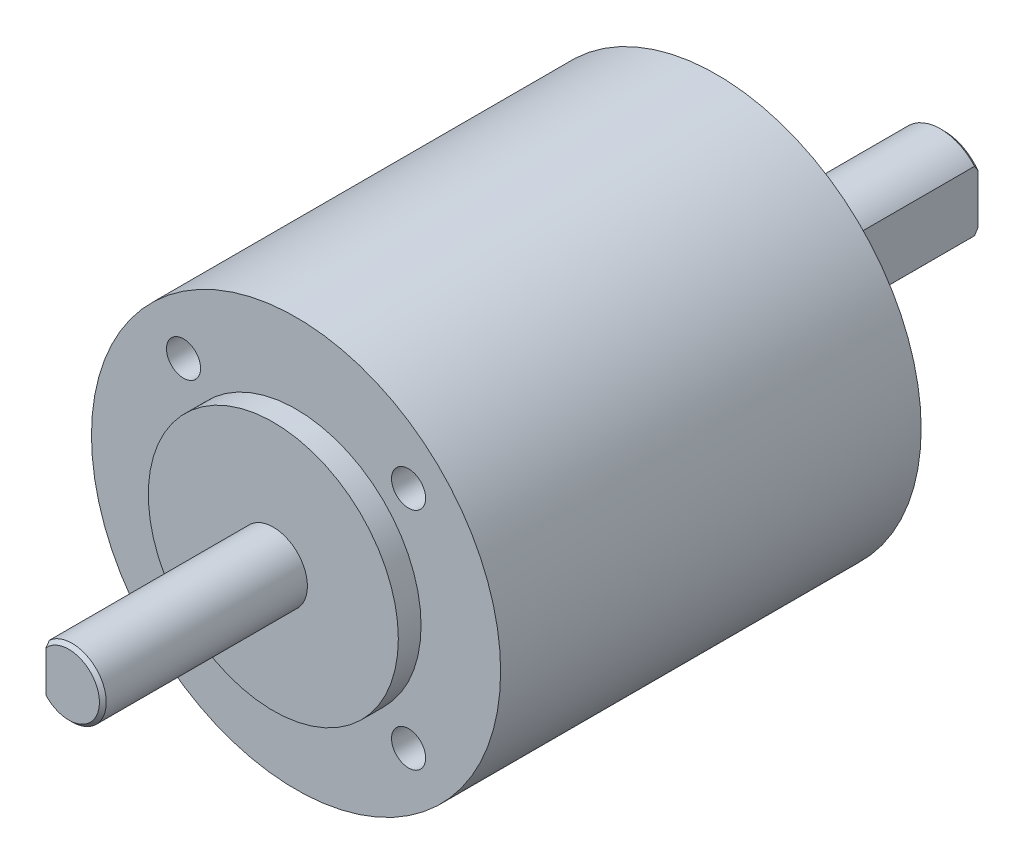
ISO-10303-21;
HEADER;
FILE_DESCRIPTION(('STEP AP214'),'2;1');
FILE_NAME('part.step','',(''),(''),'','','');
FILE_SCHEMA(('AUTOMOTIVE_DESIGN { 1 0 10303 214 1 1 1 1 }'));
ENDSEC;
DATA;
#1=APPLICATION_CONTEXT('core data for automotive mechanical design processes');
#2=APPLICATION_PROTOCOL_DEFINITION('international standard','automotive_design',2000,#1);
#3=PRODUCT_CONTEXT('',#1,'mechanical');
#4=PRODUCT('Part','Part','',(#3));
#5=PRODUCT_RELATED_PRODUCT_CATEGORY('part','',(#4));
#6=PRODUCT_DEFINITION_FORMATION('','',#4);
#7=PRODUCT_DEFINITION_CONTEXT('part definition',#1,'design');
#8=PRODUCT_DEFINITION('design','',#6,#7);
#9=PRODUCT_DEFINITION_SHAPE('','',#8);
#10=(LENGTH_UNIT() NAMED_UNIT(*) SI_UNIT(.MILLI.,.METRE.));
#11=(NAMED_UNIT(*) PLANE_ANGLE_UNIT() SI_UNIT($,.RADIAN.));
#12=(NAMED_UNIT(*) SI_UNIT($,.STERADIAN.) SOLID_ANGLE_UNIT());
#13=UNCERTAINTY_MEASURE_WITH_UNIT(LENGTH_MEASURE(1.E-05),#10,'distance_accuracy_value','');
#14=(GEOMETRIC_REPRESENTATION_CONTEXT(3) GLOBAL_UNCERTAINTY_ASSIGNED_CONTEXT((#13)) GLOBAL_UNIT_ASSIGNED_CONTEXT((#10,
#11,#12)) REPRESENTATION_CONTEXT('',''));
#15=CARTESIAN_POINT('',(0.,0.,0.));
#16=DIRECTION('',(0.,0.,1.));
#17=DIRECTION('',(1.,0.,0.));
#18=AXIS2_PLACEMENT_3D('',#15,#16,#17);
#19=CARTESIAN_POINT('',(0.,0.,-18.5));
#20=DIRECTION('',(0.,0.,1.));
#21=DIRECTION('',(1.,0.,0.));
#22=AXIS2_PLACEMENT_3D('',#19,#20,#21);
#23=CYLINDRICAL_SURFACE('',#22,18.);
#24=CARTESIAN_POINT('',(0.,0.,-18.5));
#25=DIRECTION('',(0.,0.,1.));
#26=DIRECTION('',(1.,0.,0.));
#27=AXIS2_PLACEMENT_3D('',#24,#25,#26);
#28=CIRCLE('',#27,18.);
#29=CARTESIAN_POINT('',(18.,0.,-18.5));
#30=VERTEX_POINT('',#29);
#31=EDGE_CURVE('E186',#30,#30,#28,.T.);
#32=ORIENTED_EDGE('',*,*,#31,.T.);
#33=EDGE_LOOP('',(#32));
#34=FACE_BOUND('',#33,.T.);
#35=CARTESIAN_POINT('',(0.,0.,18.5));
#36=DIRECTION('',(0.,0.,1.));
#37=DIRECTION('',(1.,0.,0.));
#38=AXIS2_PLACEMENT_3D('',#35,#36,#37);
#39=CIRCLE('',#38,18.);
#40=CARTESIAN_POINT('',(18.,0.,18.5));
#41=VERTEX_POINT('',#40);
#42=EDGE_CURVE('E190',#41,#41,#39,.T.);
#43=ORIENTED_EDGE('',*,*,#42,.F.);
#44=EDGE_LOOP('',(#43));
#45=FACE_BOUND('',#44,.T.);
#46=ADVANCED_FACE('F38',(#34,#45),#23,.T.);
#47=CARTESIAN_POINT('',(0.,0.,-18.5));
#48=DIRECTION('',(0.,0.,1.));
#49=DIRECTION('',(1.,0.,0.));
#50=AXIS2_PLACEMENT_3D('',#47,#48,#49);
#51=PLANE('',#50);
#52=CARTESIAN_POINT('',(9.89949493661111,-9.89949493661167,-18.5));
#53=DIRECTION('',(0.,0.,-1.));
#54=DIRECTION('',(-1.,0.,0.));
#55=AXIS2_PLACEMENT_3D('',#52,#53,#54);
#56=CIRCLE('',#55,1.50000000000023);
#57=CARTESIAN_POINT('',(8.39949493661089,-9.89949493661167,-18.5));
#58=VERTEX_POINT('',#57);
#59=EDGE_CURVE('E126',#58,#58,#56,.T.);
#60=ORIENTED_EDGE('',*,*,#59,.F.);
#61=EDGE_LOOP('',(#60));
#62=FACE_BOUND('',#61,.T.);
#63=CARTESIAN_POINT('',(-9.89949493661222,-9.89949493661111,-18.5));
#64=DIRECTION('',(0.,0.,-1.));
#65=DIRECTION('',(-1.,0.,0.));
#66=AXIS2_PLACEMENT_3D('',#63,#64,#65);
#67=CIRCLE('',#66,1.50000000000071);
#68=CARTESIAN_POINT('',(-11.3994949366129,-9.89949493661111,-18.5));
#69=VERTEX_POINT('',#68);
#70=EDGE_CURVE('E138',#69,#69,#67,.T.);
#71=ORIENTED_EDGE('',*,*,#70,.F.);
#72=EDGE_LOOP('',(#71));
#73=FACE_BOUND('',#72,.T.);
#74=CARTESIAN_POINT('',(-9.89949493661167,9.89949493661222,-18.5));
#75=DIRECTION('',(0.,0.,-1.));
#76=DIRECTION('',(-1.,0.,0.));
#77=AXIS2_PLACEMENT_3D('',#74,#75,#76);
#78=CIRCLE('',#77,1.5000000000005);
#79=CARTESIAN_POINT('',(-11.3994949366122,9.89949493661222,-18.5));
#80=VERTEX_POINT('',#79);
#81=EDGE_CURVE('E132',#80,#80,#78,.T.);
#82=ORIENTED_EDGE('',*,*,#81,.F.);
#83=EDGE_LOOP('',(#82));
#84=FACE_BOUND('',#83,.T.);
#85=CARTESIAN_POINT('',(9.89949493661172,9.89949493661161,-18.5));
#86=DIRECTION('',(0.,0.,-1.));
#87=DIRECTION('',(-1.,0.,0.));
#88=AXIS2_PLACEMENT_3D('',#85,#86,#87);
#89=CIRCLE('',#88,1.5);
#90=CARTESIAN_POINT('',(8.39949493661172,9.89949493661161,-18.5));
#91=VERTEX_POINT('',#90);
#92=EDGE_CURVE('E131',#91,#91,#89,.T.);
#93=ORIENTED_EDGE('',*,*,#92,.F.);
#94=EDGE_LOOP('',(#93));
#95=FACE_BOUND('',#94,.T.);
#96=CARTESIAN_POINT('',(0.,0.,-18.5));
#97=DIRECTION('',(0.,0.,1.));
#98=DIRECTION('',(1.,0.,0.));
#99=AXIS2_PLACEMENT_3D('',#96,#97,#98);
#100=CIRCLE('',#99,11.);
#101=CARTESIAN_POINT('',(11.,0.,-18.5));
#102=VERTEX_POINT('',#101);
#103=EDGE_CURVE('E189',#102,#102,#100,.F.);
#104=ORIENTED_EDGE('',*,*,#103,.F.);
#105=EDGE_LOOP('',(#104));
#106=FACE_BOUND('',#105,.T.);
#107=ORIENTED_EDGE('',*,*,#31,.F.);
#108=EDGE_LOOP('',(#107));
#109=FACE_BOUND('',#108,.T.);
#110=ADVANCED_FACE('F272',(#62,#73,#84,#95,#106,#109),#51,.F.);
#111=CARTESIAN_POINT('',(0.,0.,18.5));
#112=DIRECTION('',(0.,0.,1.));
#113=DIRECTION('',(1.,0.,0.));
#114=AXIS2_PLACEMENT_3D('',#111,#112,#113);
#115=PLANE('',#114);
#116=CARTESIAN_POINT('',(-9.8994949366111,-9.89949493661167,18.5));
#117=DIRECTION('',(0.,0.,1.));
#118=DIRECTION('',(1.,0.,0.));
#119=AXIS2_PLACEMENT_3D('',#116,#117,#118);
#120=CIRCLE('',#119,1.50000000000023);
#121=CARTESIAN_POINT('',(-8.39949493661087,-9.89949493661167,18.5));
#122=VERTEX_POINT('',#121);
#123=EDGE_CURVE('E171',#122,#122,#120,.T.);
#124=ORIENTED_EDGE('',*,*,#123,.F.);
#125=EDGE_LOOP('',(#124));
#126=FACE_BOUND('',#125,.T.);
#127=CARTESIAN_POINT('',(9.89949493661223,-9.8994949366111,18.5));
#128=DIRECTION('',(0.,0.,1.));
#129=DIRECTION('',(1.,0.,0.));
#130=AXIS2_PLACEMENT_3D('',#127,#128,#129);
#131=CIRCLE('',#130,1.50000000000073);
#132=CARTESIAN_POINT('',(11.399494936613,-9.8994949366111,18.5));
#133=VERTEX_POINT('',#132);
#134=EDGE_CURVE('E165',#133,#133,#131,.T.);
#135=ORIENTED_EDGE('',*,*,#134,.F.);
#136=EDGE_LOOP('',(#135));
#137=FACE_BOUND('',#136,.T.);
#138=CARTESIAN_POINT('',(9.89949493661167,9.89949493661222,18.5));
#139=DIRECTION('',(0.,0.,1.));
#140=DIRECTION('',(1.,0.,0.));
#141=AXIS2_PLACEMENT_3D('',#138,#139,#140);
#142=CIRCLE('',#141,1.50000000000051);
#143=CARTESIAN_POINT('',(11.3994949366122,9.89949493661222,18.5));
#144=VERTEX_POINT('',#143);
#145=EDGE_CURVE('E159',#144,#144,#142,.T.);
#146=ORIENTED_EDGE('',*,*,#145,.F.);
#147=EDGE_LOOP('',(#146));
#148=FACE_BOUND('',#147,.T.);
#149=CARTESIAN_POINT('',(-9.89949493661172,9.89949493661161,18.5));
#150=DIRECTION('',(0.,0.,1.));
#151=DIRECTION('',(1.,0.,0.));
#152=AXIS2_PLACEMENT_3D('',#149,#150,#151);
#153=CIRCLE('',#152,1.5);
#154=CARTESIAN_POINT('',(-8.39949493661172,9.89949493661161,18.5));
#155=VERTEX_POINT('',#154);
#156=EDGE_CURVE('E158',#155,#155,#153,.T.);
#157=ORIENTED_EDGE('',*,*,#156,.F.);
#158=EDGE_LOOP('',(#157));
#159=FACE_BOUND('',#158,.T.);
#160=CARTESIAN_POINT('',(0.,0.,18.5));
#161=DIRECTION('',(0.,0.,1.));
#162=DIRECTION('',(1.,0.,0.));
#163=AXIS2_PLACEMENT_3D('',#160,#161,#162);
#164=CIRCLE('',#163,11.);
#165=CARTESIAN_POINT('',(11.,0.,18.5));
#166=VERTEX_POINT('',#165);
#167=EDGE_CURVE('E177',#166,#166,#164,.T.);
#168=ORIENTED_EDGE('',*,*,#167,.F.);
#169=EDGE_LOOP('',(#168));
#170=FACE_BOUND('',#169,.T.);
#171=ORIENTED_EDGE('',*,*,#42,.T.);
#172=EDGE_LOOP('',(#171));
#173=FACE_BOUND('',#172,.T.);
#174=ADVANCED_FACE('F277',(#126,#137,#148,#159,#170,#173),#115,.T.);
#175=CARTESIAN_POINT('',(0.,0.,20.5));
#176=DIRECTION('',(0.,0.,-1.));
#177=DIRECTION('',(-1.,0.,0.));
#178=AXIS2_PLACEMENT_3D('',#175,#176,#177);
#179=CYLINDRICAL_SURFACE('',#178,11.);
#180=CARTESIAN_POINT('',(0.,0.,20.5));
#181=DIRECTION('',(0.,0.,1.));
#182=DIRECTION('',(1.,0.,0.));
#183=AXIS2_PLACEMENT_3D('',#180,#181,#182);
#184=CIRCLE('',#183,11.);
#185=CARTESIAN_POINT('',(11.,0.,20.5));
#186=VERTEX_POINT('',#185);
#187=EDGE_CURVE('E180',#186,#186,#184,.T.);
#188=ORIENTED_EDGE('',*,*,#187,.F.);
#189=EDGE_LOOP('',(#188));
#190=FACE_BOUND('',#189,.T.);
#191=ORIENTED_EDGE('',*,*,#167,.T.);
#192=EDGE_LOOP('',(#191));
#193=FACE_BOUND('',#192,.T.);
#194=ADVANCED_FACE('F283',(#190,#193),#179,.T.);
#195=CARTESIAN_POINT('',(0.,0.,20.5));
#196=DIRECTION('',(0.,0.,1.));
#197=DIRECTION('',(1.,0.,0.));
#198=AXIS2_PLACEMENT_3D('',#195,#196,#197);
#199=PLANE('',#198);
#200=CARTESIAN_POINT('',(0.,0.,20.5));
#201=DIRECTION('',(0.,0.,1.));
#202=DIRECTION('',(1.,0.,0.));
#203=AXIS2_PLACEMENT_3D('',#200,#201,#202);
#204=CIRCLE('',#203,3.);
#205=CARTESIAN_POINT('',(3.,0.,20.5));
#206=VERTEX_POINT('',#205);
#207=EDGE_CURVE('E183',#206,#206,#204,.T.);
#208=ORIENTED_EDGE('',*,*,#207,.F.);
#209=EDGE_LOOP('',(#208));
#210=FACE_BOUND('',#209,.T.);
#211=ORIENTED_EDGE('',*,*,#187,.T.);
#212=EDGE_LOOP('',(#211));
#213=FACE_BOUND('',#212,.T.);
#214=ADVANCED_FACE('F293',(#210,#213),#199,.T.);
#215=CARTESIAN_POINT('',(0.,0.,38.5));
#216=DIRECTION('',(0.,0.,1.));
#217=DIRECTION('',(1.,0.,0.));
#218=AXIS2_PLACEMENT_3D('',#215,#216,#217);
#219=PLANE('',#218);
#220=DIRECTION('',(0.,1.,0.));
#221=VECTOR('',#220,1.);
#222=CARTESIAN_POINT('',(-2.,2.23606797749979,38.5));
#223=LINE('',#222,#221);
#224=CARTESIAN_POINT('',(-2.,-1.81383571472174,38.5));
#225=VERTEX_POINT('',#224);
#226=CARTESIAN_POINT('',(-2.,1.81383571472174,38.5));
#227=VERTEX_POINT('',#226);
#228=EDGE_CURVE('E114',#225,#227,#223,.T.);
#229=ORIENTED_EDGE('',*,*,#228,.F.);
#230=CARTESIAN_POINT('',(0.,0.,38.5));
#231=DIRECTION('',(0.,0.,1.));
#232=DIRECTION('',(1.,0.,0.));
#233=AXIS2_PLACEMENT_3D('',#230,#231,#232);
#234=CIRCLE('',#233,2.70000000000002);
#235=EDGE_CURVE('E247',#225,#227,#234,.T.);
#236=ORIENTED_EDGE('',*,*,#235,.T.);
#237=EDGE_LOOP('',(#229,#236));
#238=FACE_BOUND('',#237,.T.);
#239=ADVANCED_FACE('F290',(#238),#219,.T.);
#240=CARTESIAN_POINT('',(0.,0.,38.5));
#241=DIRECTION('',(0.,0.,-1.));
#242=DIRECTION('',(-1.,0.,0.));
#243=AXIS2_PLACEMENT_3D('',#240,#241,#242);
#244=CYLINDRICAL_SURFACE('',#243,3.);
#245=DIRECTION('',(0.,0.,1.));
#246=VECTOR('',#245,1.);
#247=CARTESIAN_POINT('',(-2.,2.23606797749979,23.5));
#248=LINE('',#247,#246);
#249=CARTESIAN_POINT('',(-2.,2.23606797749979,23.5));
#250=VERTEX_POINT('',#249);
#251=CARTESIAN_POINT('',(-2.,2.23606797749979,38.2));
#252=VERTEX_POINT('',#251);
#253=EDGE_CURVE('E124',#250,#252,#248,.T.);
#254=ORIENTED_EDGE('',*,*,#253,.T.);
#255=CARTESIAN_POINT('',(0.,0.,38.2));
#256=DIRECTION('',(0.,0.,1.));
#257=DIRECTION('',(1.,0.,0.));
#258=AXIS2_PLACEMENT_3D('',#255,#256,#257);
#259=CIRCLE('',#258,3.);
#260=CARTESIAN_POINT('',(-2.,-2.23606797749979,38.2));
#261=VERTEX_POINT('',#260);
#262=EDGE_CURVE('E11',#252,#261,#259,.F.);
#263=ORIENTED_EDGE('',*,*,#262,.T.);
#264=DIRECTION('',(0.,0.,1.));
#265=VECTOR('',#264,1.);
#266=CARTESIAN_POINT('',(-2.,-2.23606797749979,23.5));
#267=LINE('',#266,#265);
#268=CARTESIAN_POINT('',(-2.,-2.23606797749979,23.5));
#269=VERTEX_POINT('',#268);
#270=EDGE_CURVE('E122',#269,#261,#267,.T.);
#271=ORIENTED_EDGE('',*,*,#270,.F.);
#272=CARTESIAN_POINT('',(0.,0.,23.5));
#273=DIRECTION('',(0.,0.,1.));
#274=DIRECTION('',(1.,0.,0.));
#275=AXIS2_PLACEMENT_3D('',#272,#273,#274);
#276=CIRCLE('',#275,3.);
#277=EDGE_CURVE('E118',#250,#269,#276,.T.);
#278=ORIENTED_EDGE('',*,*,#277,.F.);
#279=EDGE_LOOP('',(#254,#263,#271,#278));
#280=FACE_BOUND('',#279,.T.);
#281=ORIENTED_EDGE('',*,*,#207,.T.);
#282=EDGE_LOOP('',(#281));
#283=FACE_BOUND('',#282,.T.);
#284=ADVANCED_FACE('F286',(#280,#283),#244,.T.);
#285=CARTESIAN_POINT('',(-9.89949493661172,9.89949493661161,10.5));
#286=DIRECTION('',(0.,0.,1.));
#287=DIRECTION('',(1.,0.,0.));
#288=AXIS2_PLACEMENT_3D('',#285,#286,#287);
#289=CYLINDRICAL_SURFACE('',#288,1.5);
#290=CARTESIAN_POINT('',(-9.89949493661172,9.89949493661161,10.5));
#291=DIRECTION('',(0.,0.,1.));
#292=DIRECTION('',(1.,0.,0.));
#293=AXIS2_PLACEMENT_3D('',#290,#291,#292);
#294=CIRCLE('',#293,1.5);
#295=CARTESIAN_POINT('',(-8.39949493661172,9.89949493661161,10.5));
#296=VERTEX_POINT('',#295);
#297=EDGE_CURVE('E174',#296,#296,#294,.T.);
#298=ORIENTED_EDGE('',*,*,#297,.F.);
#299=EDGE_LOOP('',(#298));
#300=FACE_BOUND('',#299,.T.);
#301=ORIENTED_EDGE('',*,*,#156,.T.);
#302=EDGE_LOOP('',(#301));
#303=FACE_BOUND('',#302,.T.);
#304=ADVANCED_FACE('F289',(#300,#303),#289,.F.);
#305=CARTESIAN_POINT('',(-9.89949493661172,9.89949493661161,10.5));
#306=DIRECTION('',(0.,0.,1.));
#307=DIRECTION('',(1.,0.,0.));
#308=AXIS2_PLACEMENT_3D('',#305,#306,#307);
#309=PLANE('',#308);
#310=ORIENTED_EDGE('',*,*,#297,.T.);
#311=EDGE_LOOP('',(#310));
#312=FACE_BOUND('',#311,.T.);
#313=ADVANCED_FACE('F302',(#312),#309,.T.);
#314=CARTESIAN_POINT('',(9.89949493661167,9.89949493661222,10.5));
#315=DIRECTION('',(0.,0.,1.));
#316=DIRECTION('',(1.,0.,0.));
#317=AXIS2_PLACEMENT_3D('',#314,#315,#316);
#318=CYLINDRICAL_SURFACE('',#317,1.50000000000051);
#319=CARTESIAN_POINT('',(9.89949493661167,9.89949493661222,10.5));
#320=DIRECTION('',(0.,0.,1.));
#321=DIRECTION('',(1.,0.,0.));
#322=AXIS2_PLACEMENT_3D('',#319,#320,#321);
#323=CIRCLE('',#322,1.50000000000051);
#324=CARTESIAN_POINT('',(11.3994949366122,9.89949493661222,10.5));
#325=VERTEX_POINT('',#324);
#326=EDGE_CURVE('E155',#325,#325,#323,.T.);
#327=ORIENTED_EDGE('',*,*,#326,.F.);
#328=EDGE_LOOP('',(#327));
#329=FACE_BOUND('',#328,.T.);
#330=ORIENTED_EDGE('',*,*,#145,.T.);
#331=EDGE_LOOP('',(#330));
#332=FACE_BOUND('',#331,.T.);
#333=ADVANCED_FACE('F306',(#329,#332),#318,.F.);
#334=CARTESIAN_POINT('',(9.89949493661167,9.89949493661222,10.5));
#335=DIRECTION('',(0.,0.,1.));
#336=DIRECTION('',(1.,0.,0.));
#337=AXIS2_PLACEMENT_3D('',#334,#335,#336);
#338=PLANE('',#337);
#339=ORIENTED_EDGE('',*,*,#326,.T.);
#340=EDGE_LOOP('',(#339));
#341=FACE_BOUND('',#340,.T.);
#342=ADVANCED_FACE('F320',(#341),#338,.T.);
#343=CARTESIAN_POINT('',(9.89949493661223,-9.8994949366111,10.5));
#344=DIRECTION('',(0.,0.,1.));
#345=DIRECTION('',(1.,0.,0.));
#346=AXIS2_PLACEMENT_3D('',#343,#344,#345);
#347=CYLINDRICAL_SURFACE('',#346,1.50000000000073);
#348=CARTESIAN_POINT('',(9.89949493661223,-9.8994949366111,10.5));
#349=DIRECTION('',(0.,0.,1.));
#350=DIRECTION('',(1.,0.,0.));
#351=AXIS2_PLACEMENT_3D('',#348,#349,#350);
#352=CIRCLE('',#351,1.50000000000073);
#353=CARTESIAN_POINT('',(11.399494936613,-9.8994949366111,10.5));
#354=VERTEX_POINT('',#353);
#355=EDGE_CURVE('E162',#354,#354,#352,.T.);
#356=ORIENTED_EDGE('',*,*,#355,.F.);
#357=EDGE_LOOP('',(#356));
#358=FACE_BOUND('',#357,.T.);
#359=ORIENTED_EDGE('',*,*,#134,.T.);
#360=EDGE_LOOP('',(#359));
#361=FACE_BOUND('',#360,.T.);
#362=ADVANCED_FACE('F317',(#358,#361),#347,.F.);
#363=CARTESIAN_POINT('',(9.89949493661223,-9.8994949366111,10.5));
#364=DIRECTION('',(0.,0.,1.));
#365=DIRECTION('',(1.,0.,0.));
#366=AXIS2_PLACEMENT_3D('',#363,#364,#365);
#367=PLANE('',#366);
#368=ORIENTED_EDGE('',*,*,#355,.T.);
#369=EDGE_LOOP('',(#368));
#370=FACE_BOUND('',#369,.T.);
#371=ADVANCED_FACE('F312',(#370),#367,.T.);
#372=CARTESIAN_POINT('',(-9.8994949366111,-9.89949493661167,10.5));
#373=DIRECTION('',(0.,0.,1.));
#374=DIRECTION('',(1.,0.,0.));
#375=AXIS2_PLACEMENT_3D('',#372,#373,#374);
#376=CYLINDRICAL_SURFACE('',#375,1.50000000000023);
#377=CARTESIAN_POINT('',(-9.8994949366111,-9.89949493661167,10.5));
#378=DIRECTION('',(0.,0.,1.));
#379=DIRECTION('',(1.,0.,0.));
#380=AXIS2_PLACEMENT_3D('',#377,#378,#379);
#381=CIRCLE('',#380,1.50000000000023);
#382=CARTESIAN_POINT('',(-8.39949493661087,-9.89949493661167,10.5));
#383=VERTEX_POINT('',#382);
#384=EDGE_CURVE('E168',#383,#383,#381,.T.);
#385=ORIENTED_EDGE('',*,*,#384,.F.);
#386=EDGE_LOOP('',(#385));
#387=FACE_BOUND('',#386,.T.);
#388=ORIENTED_EDGE('',*,*,#123,.T.);
#389=EDGE_LOOP('',(#388));
#390=FACE_BOUND('',#389,.T.);
#391=ADVANCED_FACE('F308',(#387,#390),#376,.F.);
#392=CARTESIAN_POINT('',(-9.8994949366111,-9.89949493661167,10.5));
#393=DIRECTION('',(0.,0.,1.));
#394=DIRECTION('',(1.,0.,0.));
#395=AXIS2_PLACEMENT_3D('',#392,#393,#394);
#396=PLANE('',#395);
#397=ORIENTED_EDGE('',*,*,#384,.T.);
#398=EDGE_LOOP('',(#397));
#399=FACE_BOUND('',#398,.T.);
#400=ADVANCED_FACE('F311',(#399),#396,.T.);
#401=CARTESIAN_POINT('',(0.,0.,-20.5));
#402=DIRECTION('',(0.,0.,1.));
#403=DIRECTION('',(1.,0.,0.));
#404=AXIS2_PLACEMENT_3D('',#401,#402,#403);
#405=CYLINDRICAL_SURFACE('',#404,11.);
#406=CARTESIAN_POINT('',(0.,0.,-20.5));
#407=DIRECTION('',(0.,0.,-1.));
#408=DIRECTION('',(-1.,0.,0.));
#409=AXIS2_PLACEMENT_3D('',#406,#407,#408);
#410=CIRCLE('',#409,11.);
#411=CARTESIAN_POINT('',(-11.,0.,-20.5));
#412=VERTEX_POINT('',#411);
#413=EDGE_CURVE('E149',#412,#412,#410,.T.);
#414=ORIENTED_EDGE('',*,*,#413,.F.);
#415=EDGE_LOOP('',(#414));
#416=FACE_BOUND('',#415,.T.);
#417=ORIENTED_EDGE('',*,*,#103,.T.);
#418=EDGE_LOOP('',(#417));
#419=FACE_BOUND('',#418,.T.);
#420=ADVANCED_FACE('F267',(#416,#419),#405,.T.);
#421=CARTESIAN_POINT('',(0.,0.,-20.5));
#422=DIRECTION('',(0.,0.,-1.));
#423=DIRECTION('',(-1.,0.,0.));
#424=AXIS2_PLACEMENT_3D('',#421,#422,#423);
#425=PLANE('',#424);
#426=CARTESIAN_POINT('',(0.,0.,-20.5));
#427=DIRECTION('',(0.,0.,-1.));
#428=DIRECTION('',(-1.,0.,0.));
#429=AXIS2_PLACEMENT_3D('',#426,#427,#428);
#430=CIRCLE('',#429,4.);
#431=CARTESIAN_POINT('',(-4.,0.,-20.5));
#432=VERTEX_POINT('',#431);
#433=EDGE_CURVE('E154',#432,#432,#430,.T.);
#434=ORIENTED_EDGE('',*,*,#433,.F.);
#435=EDGE_LOOP('',(#434));
#436=FACE_BOUND('',#435,.T.);
#437=ORIENTED_EDGE('',*,*,#413,.T.);
#438=EDGE_LOOP('',(#437));
#439=FACE_BOUND('',#438,.T.);
#440=ADVANCED_FACE('F259',(#436,#439),#425,.T.);
#441=CARTESIAN_POINT('',(0.,0.,-38.5));
#442=DIRECTION('',(0.,0.,-1.));
#443=DIRECTION('',(-1.,0.,0.));
#444=AXIS2_PLACEMENT_3D('',#441,#442,#443);
#445=PLANE('',#444);
#446=DIRECTION('',(0.,1.,0.));
#447=VECTOR('',#446,1.);
#448=CARTESIAN_POINT('',(3.,2.64575131106459,-38.5));
#449=LINE('',#448,#447);
#450=CARTESIAN_POINT('',(3.,-2.16564078277081,-38.5));
#451=VERTEX_POINT('',#450);
#452=CARTESIAN_POINT('',(3.,2.16564078277081,-38.5));
#453=VERTEX_POINT('',#452);
#454=EDGE_CURVE('E99',#451,#453,#449,.T.);
#455=ORIENTED_EDGE('',*,*,#454,.F.);
#456=CARTESIAN_POINT('',(0.,0.,-38.5));
#457=DIRECTION('',(0.,0.,-1.));
#458=DIRECTION('',(-1.,0.,0.));
#459=AXIS2_PLACEMENT_3D('',#456,#457,#458);
#460=CIRCLE('',#459,3.70000000000002);
#461=EDGE_CURVE('E199',#451,#453,#460,.T.);
#462=ORIENTED_EDGE('',*,*,#461,.T.);
#463=EDGE_LOOP('',(#455,#462));
#464=FACE_BOUND('',#463,.T.);
#465=ADVANCED_FACE('F257',(#464),#445,.T.);
#466=CARTESIAN_POINT('',(0.,0.,-38.5));
#467=DIRECTION('',(0.,0.,1.));
#468=DIRECTION('',(1.,0.,0.));
#469=AXIS2_PLACEMENT_3D('',#466,#467,#468);
#470=CYLINDRICAL_SURFACE('',#469,4.);
#471=DIRECTION('',(0.,0.,-1.));
#472=VECTOR('',#471,1.);
#473=CARTESIAN_POINT('',(3.,2.64575131106459,-23.5));
#474=LINE('',#473,#472);
#475=CARTESIAN_POINT('',(3.,2.64575131106459,-23.5));
#476=VERTEX_POINT('',#475);
#477=CARTESIAN_POINT('',(3.,2.64575131106459,-38.2));
#478=VERTEX_POINT('',#477);
#479=EDGE_CURVE('E107',#476,#478,#474,.T.);
#480=ORIENTED_EDGE('',*,*,#479,.T.);
#481=CARTESIAN_POINT('',(0.,0.,-38.2));
#482=DIRECTION('',(0.,0.,-1.));
#483=DIRECTION('',(-1.,0.,0.));
#484=AXIS2_PLACEMENT_3D('',#481,#482,#483);
#485=CIRCLE('',#484,4.);
#486=CARTESIAN_POINT('',(3.,-2.64575131106459,-38.2));
#487=VERTEX_POINT('',#486);
#488=EDGE_CURVE('E112',#478,#487,#485,.F.);
#489=ORIENTED_EDGE('',*,*,#488,.T.);
#490=DIRECTION('',(0.,0.,-1.));
#491=VECTOR('',#490,1.);
#492=CARTESIAN_POINT('',(3.,-2.64575131106459,-23.5));
#493=LINE('',#492,#491);
#494=CARTESIAN_POINT('',(3.,-2.64575131106459,-23.5));
#495=VERTEX_POINT('',#494);
#496=EDGE_CURVE('E105',#495,#487,#493,.T.);
#497=ORIENTED_EDGE('',*,*,#496,.F.);
#498=CARTESIAN_POINT('',(0.,0.,-23.5));
#499=DIRECTION('',(0.,0.,-1.));
#500=DIRECTION('',(-1.,0.,0.));
#501=AXIS2_PLACEMENT_3D('',#498,#499,#500);
#502=CIRCLE('',#501,4.);
#503=EDGE_CURVE('E91',#476,#495,#502,.T.);
#504=ORIENTED_EDGE('',*,*,#503,.F.);
#505=EDGE_LOOP('',(#480,#489,#497,#504));
#506=FACE_BOUND('',#505,.T.);
#507=ORIENTED_EDGE('',*,*,#433,.T.);
#508=EDGE_LOOP('',(#507));
#509=FACE_BOUND('',#508,.T.);
#510=ADVANCED_FACE('F109',(#506,#509),#470,.T.);
#511=CARTESIAN_POINT('',(9.89949493661172,9.89949493661161,-10.5));
#512=DIRECTION('',(0.,0.,-1.));
#513=DIRECTION('',(-1.,0.,0.));
#514=AXIS2_PLACEMENT_3D('',#511,#512,#513);
#515=CYLINDRICAL_SURFACE('',#514,1.5);
#516=CARTESIAN_POINT('',(9.89949493661172,9.89949493661161,-10.5));
#517=DIRECTION('',(0.,0.,-1.));
#518=DIRECTION('',(-1.,0.,0.));
#519=AXIS2_PLACEMENT_3D('',#516,#517,#518);
#520=CIRCLE('',#519,1.5);
#521=CARTESIAN_POINT('',(8.39949493661172,9.89949493661161,-10.5));
#522=VERTEX_POINT('',#521);
#523=EDGE_CURVE('E146',#522,#522,#520,.T.);
#524=ORIENTED_EDGE('',*,*,#523,.F.);
#525=EDGE_LOOP('',(#524));
#526=FACE_BOUND('',#525,.T.);
#527=ORIENTED_EDGE('',*,*,#92,.T.);
#528=EDGE_LOOP('',(#527));
#529=FACE_BOUND('',#528,.T.);
#530=ADVANCED_FACE('F265',(#526,#529),#515,.F.);
#531=CARTESIAN_POINT('',(9.89949493661172,9.89949493661161,-10.5));
#532=DIRECTION('',(0.,0.,-1.));
#533=DIRECTION('',(-1.,0.,0.));
#534=AXIS2_PLACEMENT_3D('',#531,#532,#533);
#535=PLANE('',#534);
#536=ORIENTED_EDGE('',*,*,#523,.T.);
#537=EDGE_LOOP('',(#536));
#538=FACE_BOUND('',#537,.T.);
#539=ADVANCED_FACE('F389',(#538),#535,.T.);
#540=CARTESIAN_POINT('',(-9.89949493661167,9.89949493661222,-10.5));
#541=DIRECTION('',(0.,0.,-1.));
#542=DIRECTION('',(-1.,0.,0.));
#543=AXIS2_PLACEMENT_3D('',#540,#541,#542);
#544=CYLINDRICAL_SURFACE('',#543,1.5000000000005);
#545=CARTESIAN_POINT('',(-9.89949493661167,9.89949493661222,-10.5));
#546=DIRECTION('',(0.,0.,-1.));
#547=DIRECTION('',(-1.,0.,0.));
#548=AXIS2_PLACEMENT_3D('',#545,#546,#547);
#549=CIRCLE('',#548,1.5000000000005);
#550=CARTESIAN_POINT('',(-11.3994949366122,9.89949493661222,-10.5));
#551=VERTEX_POINT('',#550);
#552=EDGE_CURVE('E128',#551,#551,#549,.T.);
#553=ORIENTED_EDGE('',*,*,#552,.F.);
#554=EDGE_LOOP('',(#553));
#555=FACE_BOUND('',#554,.T.);
#556=ORIENTED_EDGE('',*,*,#81,.T.);
#557=EDGE_LOOP('',(#556));
#558=FACE_BOUND('',#557,.T.);
#559=ADVANCED_FACE('F399',(#555,#558),#544,.F.);
#560=CARTESIAN_POINT('',(-9.89949493661167,9.89949493661222,-10.5));
#561=DIRECTION('',(0.,0.,-1.));
#562=DIRECTION('',(-1.,0.,0.));
#563=AXIS2_PLACEMENT_3D('',#560,#561,#562);
#564=PLANE('',#563);
#565=ORIENTED_EDGE('',*,*,#552,.T.);
#566=EDGE_LOOP('',(#565));
#567=FACE_BOUND('',#566,.T.);
#568=ADVANCED_FACE('F233',(#567),#564,.T.);
#569=CARTESIAN_POINT('',(-9.89949493661222,-9.89949493661111,-10.5));
#570=DIRECTION('',(0.,0.,-1.));
#571=DIRECTION('',(-1.,0.,0.));
#572=AXIS2_PLACEMENT_3D('',#569,#570,#571);
#573=CYLINDRICAL_SURFACE('',#572,1.50000000000071);
#574=CARTESIAN_POINT('',(-9.89949493661222,-9.89949493661111,-10.5));
#575=DIRECTION('',(0.,0.,-1.));
#576=DIRECTION('',(-1.,0.,0.));
#577=AXIS2_PLACEMENT_3D('',#574,#575,#576);
#578=CIRCLE('',#577,1.50000000000071);
#579=CARTESIAN_POINT('',(-11.3994949366129,-9.89949493661111,-10.5));
#580=VERTEX_POINT('',#579);
#581=EDGE_CURVE('E135',#580,#580,#578,.T.);
#582=ORIENTED_EDGE('',*,*,#581,.F.);
#583=EDGE_LOOP('',(#582));
#584=FACE_BOUND('',#583,.T.);
#585=ORIENTED_EDGE('',*,*,#70,.T.);
#586=EDGE_LOOP('',(#585));
#587=FACE_BOUND('',#586,.T.);
#588=ADVANCED_FACE('F417',(#584,#587),#573,.F.);
#589=CARTESIAN_POINT('',(-9.89949493661222,-9.89949493661111,-10.5));
#590=DIRECTION('',(0.,0.,-1.));
#591=DIRECTION('',(-1.,0.,0.));
#592=AXIS2_PLACEMENT_3D('',#589,#590,#591);
#593=PLANE('',#592);
#594=ORIENTED_EDGE('',*,*,#581,.T.);
#595=EDGE_LOOP('',(#594));
#596=FACE_BOUND('',#595,.T.);
#597=ADVANCED_FACE('F426',(#596),#593,.T.);
#598=CARTESIAN_POINT('',(9.89949493661111,-9.89949493661167,-10.5));
#599=DIRECTION('',(0.,0.,-1.));
#600=DIRECTION('',(-1.,0.,0.));
#601=AXIS2_PLACEMENT_3D('',#598,#599,#600);
#602=CYLINDRICAL_SURFACE('',#601,1.50000000000023);
#603=CARTESIAN_POINT('',(9.89949493661111,-9.89949493661167,-10.5));
#604=DIRECTION('',(0.,0.,-1.));
#605=DIRECTION('',(-1.,0.,0.));
#606=AXIS2_PLACEMENT_3D('',#603,#604,#605);
#607=CIRCLE('',#606,1.50000000000023);
#608=CARTESIAN_POINT('',(8.39949493661089,-9.89949493661167,-10.5));
#609=VERTEX_POINT('',#608);
#610=EDGE_CURVE('E141',#609,#609,#607,.T.);
#611=ORIENTED_EDGE('',*,*,#610,.F.);
#612=EDGE_LOOP('',(#611));
#613=FACE_BOUND('',#612,.T.);
#614=ORIENTED_EDGE('',*,*,#59,.T.);
#615=EDGE_LOOP('',(#614));
#616=FACE_BOUND('',#615,.T.);
#617=ADVANCED_FACE('F436',(#613,#616),#602,.F.);
#618=CARTESIAN_POINT('',(9.89949493661111,-9.89949493661167,-10.5));
#619=DIRECTION('',(0.,0.,-1.));
#620=DIRECTION('',(-1.,0.,0.));
#621=AXIS2_PLACEMENT_3D('',#618,#619,#620);
#622=PLANE('',#621);
#623=ORIENTED_EDGE('',*,*,#610,.T.);
#624=EDGE_LOOP('',(#623));
#625=FACE_BOUND('',#624,.T.);
#626=ADVANCED_FACE('F232',(#625),#622,.T.);
#627=CARTESIAN_POINT('',(-2.,2.23606797749979,23.5));
#628=DIRECTION('',(1.,0.,0.));
#629=DIRECTION('',(0.,0.,-1.));
#630=AXIS2_PLACEMENT_3D('',#627,#628,#629);
#631=PLANE('',#630);
#632=ORIENTED_EDGE('',*,*,#228,.T.);
#633=CARTESIAN_POINT('',(-2.,1.81383571472174,38.5));
#634=CARTESIAN_POINT('',(-2.,1.84967097282552,38.4759244809417));
#635=CARTESIAN_POINT('',(-2.,1.88532587348036,38.4515821180648));
#636=CARTESIAN_POINT('',(-2.,1.95629834054682,38.4024214342682));
#637=CARTESIAN_POINT('',(-2.,1.99161595638366,38.3776031847387));
#638=CARTESIAN_POINT('',(-2.,2.06194706148337,38.3275418443418));
#639=CARTESIAN_POINT('',(-2.,2.09696055785933,38.3022987634516));
#640=CARTESIAN_POINT('',(-2.,2.16671432522583,38.2514269096799));
#641=CARTESIAN_POINT('',(-2.,2.20145455478441,38.2257980799652));
#642=CARTESIAN_POINT('',(-2.,2.23606797749991,38.2000000000002));
#643=B_SPLINE_CURVE_WITH_KNOTS('',3,(#633,#634,#635,#636,#637,#638,#639,#640,#641,#642),
.UNSPECIFIED.,.F.,.F.,(4,2,2,2,4),(0.,0.129512630510558,0.259005981875965,0.388496296306683,
0.518005879245808),.UNSPECIFIED.);
#644=EDGE_CURVE('E48',#227,#252,#643,.T.);
#645=ORIENTED_EDGE('',*,*,#644,.T.);
#646=ORIENTED_EDGE('',*,*,#253,.F.);
#647=DIRECTION('',(0.,1.,0.));
#648=VECTOR('',#647,1.);
#649=CARTESIAN_POINT('',(-2.,2.23606797749979,23.5));
#650=LINE('',#649,#648);
#651=EDGE_CURVE('E120',#269,#250,#650,.T.);
#652=ORIENTED_EDGE('',*,*,#651,.F.);
#653=ORIENTED_EDGE('',*,*,#270,.T.);
#654=CARTESIAN_POINT('',(-2.,-2.23606797749979,38.2));
#655=CARTESIAN_POINT('',(-2.,-2.20145455478436,38.2257980799651));
#656=CARTESIAN_POINT('',(-2.,-2.16671432522581,38.2514269096799));
#657=CARTESIAN_POINT('',(-2.,-2.09696055785935,38.3022987634517));
#658=CARTESIAN_POINT('',(-2.,-2.06194706148339,38.3275418443418));
#659=CARTESIAN_POINT('',(-2.,-1.99161595638365,38.3776031847386));
#660=CARTESIAN_POINT('',(-2.,-1.9562983405468,38.4024214342681));
#661=CARTESIAN_POINT('',(-2.,-1.88532587348041,38.4515821180648));
#662=CARTESIAN_POINT('',(-2.,-1.84967097282565,38.4759244809419));
#663=CARTESIAN_POINT('',(-2.,-1.81383571472205,38.5000000000004));
#664=B_SPLINE_CURVE_WITH_KNOTS('',3,(#654,#655,#656,#657,#658,#659,#660,#661,#662,#663),
.UNSPECIFIED.,.F.,.F.,(4,2,2,2,4),(0.,0.129509582939128,0.258999897369847,0.388493248735247,
0.518005879245794),.UNSPECIFIED.);
#665=EDGE_CURVE('E237',#261,#225,#664,.T.);
#666=ORIENTED_EDGE('',*,*,#665,.T.);
#667=EDGE_LOOP('',(#632,#645,#646,#652,#653,#666));
#668=FACE_BOUND('',#667,.T.);
#669=ADVANCED_FACE('F227',(#668),#631,.F.);
#670=CARTESIAN_POINT('',(0.,0.,23.5));
#671=DIRECTION('',(0.,0.,1.));
#672=DIRECTION('',(1.,0.,0.));
#673=AXIS2_PLACEMENT_3D('',#670,#671,#672);
#674=PLANE('',#673);
#675=ORIENTED_EDGE('',*,*,#277,.T.);
#676=ORIENTED_EDGE('',*,*,#651,.T.);
#677=EDGE_LOOP('',(#675,#676));
#678=FACE_BOUND('',#677,.T.);
#679=ADVANCED_FACE('F223',(#678),#674,.T.);
#680=CARTESIAN_POINT('',(3.,2.64575131106459,-23.5));
#681=DIRECTION('',(-1.,0.,0.));
#682=DIRECTION('',(0.,-1.,0.));
#683=AXIS2_PLACEMENT_3D('',#680,#681,#682);
#684=PLANE('',#683);
#685=ORIENTED_EDGE('',*,*,#454,.T.);
#686=CARTESIAN_POINT('',(3.,2.16564078277081,-38.5));
#687=CARTESIAN_POINT('',(3.,2.20636622215953,-38.4761619312021));
#688=CARTESIAN_POINT('',(3.,2.24689912393182,-38.45199678447));
#689=CARTESIAN_POINT('',(3.,2.32759423863404,-38.4030718361086));
#690=CARTESIAN_POINT('',(3.,2.36775651948145,-38.3783121465521));
#691=CARTESIAN_POINT('',(3.,2.4477391003197,-38.3282492162509));
#692=CARTESIAN_POINT('',(3.,2.48755940796065,-38.30294598771));
#693=CARTESIAN_POINT('',(3.,2.56688695576195,-38.2518371229946));
#694=CARTESIAN_POINT('',(3.,2.60639413597521,-38.226031393738));
#695=CARTESIAN_POINT('',(3.,2.64575131106471,-38.2000000000002));
#696=B_SPLINE_CURVE_WITH_KNOTS('',3,(#686,#687,#688,#689,#690,#691,#692,#693,#694,#695),
.UNSPECIFIED.,.F.,.F.,(4,2,2,2,4),(0.,0.141564544236551,0.283102609509429,0.424637500217298,
0.566198862693888),.UNSPECIFIED.);
#697=EDGE_CURVE('E209',#453,#478,#696,.T.);
#698=ORIENTED_EDGE('',*,*,#697,.T.);
#699=ORIENTED_EDGE('',*,*,#479,.F.);
#700=DIRECTION('',(0.,1.,0.));
#701=VECTOR('',#700,1.);
#702=CARTESIAN_POINT('',(3.,2.64575131106459,-23.5));
#703=LINE('',#702,#701);
#704=EDGE_CURVE('E94',#495,#476,#703,.T.);
#705=ORIENTED_EDGE('',*,*,#704,.F.);
#706=ORIENTED_EDGE('',*,*,#496,.T.);
#707=CARTESIAN_POINT('',(3.,-2.64575131106459,-38.2));
#708=CARTESIAN_POINT('',(3.,-2.60639413597516,-38.2260313937379));
#709=CARTESIAN_POINT('',(3.,-2.56688695576194,-38.2518371229945));
#710=CARTESIAN_POINT('',(3.,-2.48755940796067,-38.3029459877101));
#711=CARTESIAN_POINT('',(3.,-2.44773910031972,-38.3282492162509));
#712=CARTESIAN_POINT('',(3.,-2.36775651948145,-38.378312146552));
#713=CARTESIAN_POINT('',(3.,-2.32759423863402,-38.4030718361086));
#714=CARTESIAN_POINT('',(3.,-2.24689912393187,-38.4519967844701));
#715=CARTESIAN_POINT('',(3.,-2.20636622215967,-38.4761619312022));
#716=CARTESIAN_POINT('',(3.,-2.16564078277113,-38.5000000000005));
#717=B_SPLINE_CURVE_WITH_KNOTS('',3,(#707,#708,#709,#710,#711,#712,#713,#714,#715,#716),
.UNSPECIFIED.,.F.,.F.,(4,2,2,2,4),(0.,0.141561362476589,0.283096253184459,0.424634318457333,
0.56619886269387),.UNSPECIFIED.);
#718=EDGE_CURVE('E202',#487,#451,#717,.T.);
#719=ORIENTED_EDGE('',*,*,#718,.T.);
#720=EDGE_LOOP('',(#685,#698,#699,#705,#706,#719));
#721=FACE_BOUND('',#720,.T.);
#722=ADVANCED_FACE('F104',(#721),#684,.F.);
#723=CARTESIAN_POINT('',(0.,0.,-23.5));
#724=DIRECTION('',(0.,0.,-1.));
#725=DIRECTION('',(-1.,0.,0.));
#726=AXIS2_PLACEMENT_3D('',#723,#724,#725);
#727=PLANE('',#726);
#728=ORIENTED_EDGE('',*,*,#503,.T.);
#729=ORIENTED_EDGE('',*,*,#704,.T.);
#730=EDGE_LOOP('',(#728,#729));
#731=FACE_BOUND('',#730,.T.);
#732=ADVANCED_FACE('F93',(#731),#727,.T.);
#733=CARTESIAN_POINT('',(0.,0.,-38.5));
#734=DIRECTION('',(0.,0.,1.));
#735=DIRECTION('',(1.,0.,0.));
#736=AXIS2_PLACEMENT_3D('',#733,#734,#735);
#737=CONICAL_SURFACE('',#736,3.70000000000002,0.785398163397454);
#738=ORIENTED_EDGE('',*,*,#718,.F.);
#739=ORIENTED_EDGE('',*,*,#488,.F.);
#740=ORIENTED_EDGE('',*,*,#697,.F.);
#741=ORIENTED_EDGE('',*,*,#461,.F.);
#742=EDGE_LOOP('',(#738,#739,#740,#741));
#743=FACE_BOUND('',#742,.T.);
#744=ADVANCED_FACE('F216',(#743),#737,.T.);
#745=CARTESIAN_POINT('',(0.,0.,38.5));
#746=DIRECTION('',(0.,0.,-1.));
#747=DIRECTION('',(-1.,0.,0.));
#748=AXIS2_PLACEMENT_3D('',#745,#746,#747);
#749=CONICAL_SURFACE('',#748,2.70000000000002,0.785398163397456);
#750=ORIENTED_EDGE('',*,*,#665,.F.);
#751=ORIENTED_EDGE('',*,*,#262,.F.);
#752=ORIENTED_EDGE('',*,*,#644,.F.);
#753=ORIENTED_EDGE('',*,*,#235,.F.);
#754=EDGE_LOOP('',(#750,#751,#752,#753));
#755=FACE_BOUND('',#754,.T.);
#756=ADVANCED_FACE('F41',(#755),#749,.T.);
#757=CLOSED_SHELL('',(#46,#110,#174,#194,#214,#239,#284,#304,#313,#333,#342,#362,#371,#391,#400,
#420,#440,#465,#510,#530,#539,#559,#568,#588,#597,#617,#626,#669,#679,#722,#732,#744,#756));
#758=MANIFOLD_SOLID_BREP('B2',#757);
#759=ADVANCED_BREP_SHAPE_REPRESENTATION('',(#18,#758),#14);
#760=SHAPE_DEFINITION_REPRESENTATION(#9,#759);
ENDSEC;
END-ISO-10303-21;
